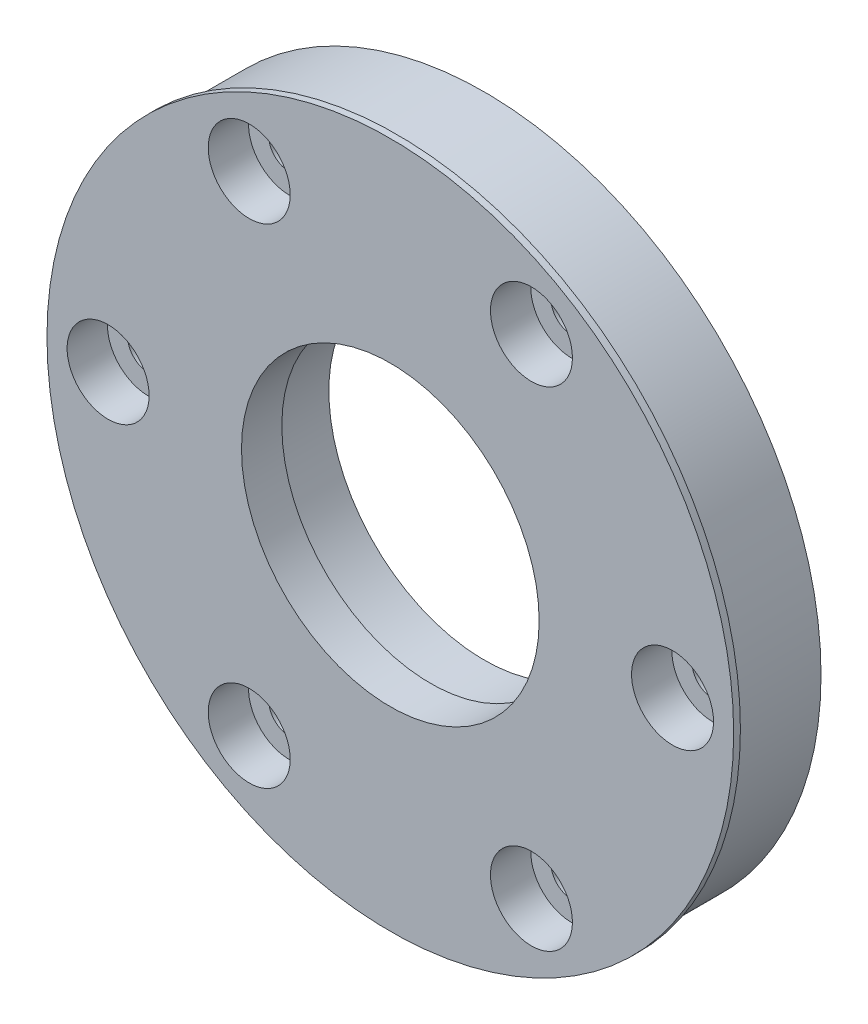
ISO-10303-21;
HEADER;
FILE_DESCRIPTION(('STEP AP214'),'2;1');
FILE_NAME('part.step','',(''),(''),'','','');
FILE_SCHEMA(('AUTOMOTIVE_DESIGN { 1 0 10303 214 1 1 1 1 }'));
ENDSEC;
DATA;
#1=APPLICATION_CONTEXT('core data for automotive mechanical design processes');
#2=APPLICATION_PROTOCOL_DEFINITION('international standard','automotive_design',2000,#1);
#3=PRODUCT_CONTEXT('',#1,'mechanical');
#4=PRODUCT('Part','Part','',(#3));
#5=PRODUCT_RELATED_PRODUCT_CATEGORY('part','',(#4));
#6=PRODUCT_DEFINITION_FORMATION('','',#4);
#7=PRODUCT_DEFINITION_CONTEXT('part definition',#1,'design');
#8=PRODUCT_DEFINITION('design','',#6,#7);
#9=PRODUCT_DEFINITION_SHAPE('','',#8);
#10=(LENGTH_UNIT() NAMED_UNIT(*) SI_UNIT(.MILLI.,.METRE.));
#11=(NAMED_UNIT(*) PLANE_ANGLE_UNIT() SI_UNIT($,.RADIAN.));
#12=(NAMED_UNIT(*) SI_UNIT($,.STERADIAN.) SOLID_ANGLE_UNIT());
#13=UNCERTAINTY_MEASURE_WITH_UNIT(LENGTH_MEASURE(1.E-05),#10,'distance_accuracy_value','');
#14=(GEOMETRIC_REPRESENTATION_CONTEXT(3) GLOBAL_UNCERTAINTY_ASSIGNED_CONTEXT((#13)) GLOBAL_UNIT_ASSIGNED_CONTEXT((#10,
#11,#12)) REPRESENTATION_CONTEXT('',''));
#15=CARTESIAN_POINT('',(0.,0.,0.));
#16=DIRECTION('',(0.,0.,1.));
#17=DIRECTION('',(1.,0.,0.));
#18=AXIS2_PLACEMENT_3D('',#15,#16,#17);
#19=CARTESIAN_POINT('',(0.,0.,0.));
#20=DIRECTION('',(0.,0.,1.));
#21=DIRECTION('',(1.,0.,0.));
#22=AXIS2_PLACEMENT_3D('',#19,#20,#21);
#23=CYLINDRICAL_SURFACE('',#22,11.575);
#24=CARTESIAN_POINT('',(0.,0.,0.));
#25=DIRECTION('',(0.,0.,1.));
#26=DIRECTION('',(1.,0.,0.));
#27=AXIS2_PLACEMENT_3D('',#24,#25,#26);
#28=CIRCLE('',#27,11.575);
#29=CARTESIAN_POINT('',(11.575,0.,0.));
#30=VERTEX_POINT('',#29);
#31=EDGE_CURVE('E203',#30,#30,#28,.T.);
#32=ORIENTED_EDGE('',*,*,#31,.F.);
#33=EDGE_LOOP('',(#32));
#34=FACE_BOUND('',#33,.T.);
#35=CARTESIAN_POINT('',(0.,0.,4.));
#36=DIRECTION('',(0.,0.,1.));
#37=DIRECTION('',(1.,0.,0.));
#38=AXIS2_PLACEMENT_3D('',#35,#36,#37);
#39=CIRCLE('',#38,11.575);
#40=CARTESIAN_POINT('',(11.575,0.,4.));
#41=VERTEX_POINT('',#40);
#42=EDGE_CURVE('E10',#41,#41,#39,.F.);
#43=ORIENTED_EDGE('',*,*,#42,.F.);
#44=EDGE_LOOP('',(#43));
#45=FACE_BOUND('',#44,.T.);
#46=ADVANCED_FACE('F41',(#34,#45),#23,.F.);
#47=CARTESIAN_POINT('',(10.5,18.1865334794732,7.));
#48=DIRECTION('',(0.,0.,-1.));
#49=DIRECTION('',(-1.,0.,0.));
#50=AXIS2_PLACEMENT_3D('',#47,#48,#49);
#51=CYLINDRICAL_SURFACE('',#50,1.55);
#52=CARTESIAN_POINT('',(10.5,18.1865334794732,4.));
#53=DIRECTION('',(0.,0.,1.));
#54=DIRECTION('',(1.,0.,0.));
#55=AXIS2_PLACEMENT_3D('',#52,#53,#54);
#56=CIRCLE('',#55,1.55);
#57=CARTESIAN_POINT('',(12.05,18.1865334794732,4.));
#58=VERTEX_POINT('',#57);
#59=EDGE_CURVE('E88',#58,#58,#56,.T.);
#60=ORIENTED_EDGE('',*,*,#59,.T.);
#61=EDGE_LOOP('',(#60));
#62=FACE_BOUND('',#61,.T.);
#63=CARTESIAN_POINT('',(10.5,18.1865334794732,1.7));
#64=DIRECTION('',(0.,0.,-1.));
#65=DIRECTION('',(-1.,0.,0.));
#66=AXIS2_PLACEMENT_3D('',#63,#64,#65);
#67=CIRCLE('',#66,1.55);
#68=CARTESIAN_POINT('',(8.95000000000001,18.1865334794732,1.7));
#69=VERTEX_POINT('',#68);
#70=EDGE_CURVE('E86',#69,#69,#67,.F.);
#71=ORIENTED_EDGE('',*,*,#70,.F.);
#72=EDGE_LOOP('',(#71));
#73=FACE_BOUND('',#72,.T.);
#74=ADVANCED_FACE('F271',(#62,#73),#51,.F.);
#75=CARTESIAN_POINT('',(-10.5,18.1865334794732,7.));
#76=DIRECTION('',(0.,0.,-1.));
#77=DIRECTION('',(-1.,0.,0.));
#78=AXIS2_PLACEMENT_3D('',#75,#76,#77);
#79=CYLINDRICAL_SURFACE('',#78,1.55);
#80=CARTESIAN_POINT('',(-10.5,18.1865334794732,4.));
#81=DIRECTION('',(0.,0.,1.));
#82=DIRECTION('',(1.,0.,0.));
#83=AXIS2_PLACEMENT_3D('',#80,#81,#82);
#84=CIRCLE('',#83,1.55);
#85=CARTESIAN_POINT('',(-8.95,18.1865334794732,4.));
#86=VERTEX_POINT('',#85);
#87=EDGE_CURVE('E93',#86,#86,#84,.T.);
#88=ORIENTED_EDGE('',*,*,#87,.T.);
#89=EDGE_LOOP('',(#88));
#90=FACE_BOUND('',#89,.T.);
#91=CARTESIAN_POINT('',(-10.5,18.1865334794732,1.7));
#92=DIRECTION('',(0.,0.,-1.));
#93=DIRECTION('',(-1.,0.,0.));
#94=AXIS2_PLACEMENT_3D('',#91,#92,#93);
#95=CIRCLE('',#94,1.55);
#96=CARTESIAN_POINT('',(-12.05,18.1865334794732,1.7));
#97=VERTEX_POINT('',#96);
#98=EDGE_CURVE('E83',#97,#97,#95,.F.);
#99=ORIENTED_EDGE('',*,*,#98,.F.);
#100=EDGE_LOOP('',(#99));
#101=FACE_BOUND('',#100,.T.);
#102=ADVANCED_FACE('F277',(#90,#101),#79,.F.);
#103=CARTESIAN_POINT('',(-21.,0.,7.));
#104=DIRECTION('',(0.,0.,-1.));
#105=DIRECTION('',(-1.,0.,0.));
#106=AXIS2_PLACEMENT_3D('',#103,#104,#105);
#107=CYLINDRICAL_SURFACE('',#106,1.55);
#108=CARTESIAN_POINT('',(-21.,0.,4.));
#109=DIRECTION('',(0.,0.,1.));
#110=DIRECTION('',(1.,0.,0.));
#111=AXIS2_PLACEMENT_3D('',#108,#109,#110);
#112=CIRCLE('',#111,1.55);
#113=CARTESIAN_POINT('',(-19.45,0.,4.));
#114=VERTEX_POINT('',#113);
#115=EDGE_CURVE('E100',#114,#114,#112,.T.);
#116=ORIENTED_EDGE('',*,*,#115,.T.);
#117=EDGE_LOOP('',(#116));
#118=FACE_BOUND('',#117,.T.);
#119=CARTESIAN_POINT('',(-21.,0.,1.7));
#120=DIRECTION('',(0.,0.,-1.));
#121=DIRECTION('',(-1.,0.,0.));
#122=AXIS2_PLACEMENT_3D('',#119,#120,#121);
#123=CIRCLE('',#122,1.55);
#124=CARTESIAN_POINT('',(-22.55,0.,1.7));
#125=VERTEX_POINT('',#124);
#126=EDGE_CURVE('E80',#125,#125,#123,.F.);
#127=ORIENTED_EDGE('',*,*,#126,.F.);
#128=EDGE_LOOP('',(#127));
#129=FACE_BOUND('',#128,.T.);
#130=ADVANCED_FACE('F458',(#118,#129),#107,.F.);
#131=CARTESIAN_POINT('',(-10.5,-18.1865334794732,7.));
#132=DIRECTION('',(0.,0.,-1.));
#133=DIRECTION('',(-1.,0.,0.));
#134=AXIS2_PLACEMENT_3D('',#131,#132,#133);
#135=CYLINDRICAL_SURFACE('',#134,1.55);
#136=CARTESIAN_POINT('',(-10.5,-18.1865334794732,4.));
#137=DIRECTION('',(0.,0.,1.));
#138=DIRECTION('',(1.,0.,0.));
#139=AXIS2_PLACEMENT_3D('',#136,#137,#138);
#140=CIRCLE('',#139,1.55);
#141=CARTESIAN_POINT('',(-8.95000000000001,-18.1865334794732,4.));
#142=VERTEX_POINT('',#141);
#143=EDGE_CURVE('E108',#142,#142,#140,.T.);
#144=ORIENTED_EDGE('',*,*,#143,.T.);
#145=EDGE_LOOP('',(#144));
#146=FACE_BOUND('',#145,.T.);
#147=CARTESIAN_POINT('',(-10.5,-18.1865334794732,1.7));
#148=DIRECTION('',(0.,0.,-1.));
#149=DIRECTION('',(-1.,0.,0.));
#150=AXIS2_PLACEMENT_3D('',#147,#148,#149);
#151=CIRCLE('',#150,1.55);
#152=CARTESIAN_POINT('',(-12.05,-18.1865334794732,1.7));
#153=VERTEX_POINT('',#152);
#154=EDGE_CURVE('E77',#153,#153,#151,.F.);
#155=ORIENTED_EDGE('',*,*,#154,.F.);
#156=EDGE_LOOP('',(#155));
#157=FACE_BOUND('',#156,.T.);
#158=ADVANCED_FACE('F449',(#146,#157),#135,.F.);
#159=CARTESIAN_POINT('',(10.5,-18.1865334794732,7.));
#160=DIRECTION('',(0.,0.,-1.));
#161=DIRECTION('',(-1.,0.,0.));
#162=AXIS2_PLACEMENT_3D('',#159,#160,#161);
#163=CYLINDRICAL_SURFACE('',#162,1.55);
#164=CARTESIAN_POINT('',(10.5,-18.1865334794732,4.));
#165=DIRECTION('',(0.,0.,1.));
#166=DIRECTION('',(1.,0.,0.));
#167=AXIS2_PLACEMENT_3D('',#164,#165,#166);
#168=CIRCLE('',#167,1.55);
#169=CARTESIAN_POINT('',(12.05,-18.1865334794732,4.));
#170=VERTEX_POINT('',#169);
#171=EDGE_CURVE('E112',#170,#170,#168,.T.);
#172=ORIENTED_EDGE('',*,*,#171,.T.);
#173=EDGE_LOOP('',(#172));
#174=FACE_BOUND('',#173,.T.);
#175=CARTESIAN_POINT('',(10.5,-18.1865334794732,1.7));
#176=DIRECTION('',(0.,0.,-1.));
#177=DIRECTION('',(-1.,0.,0.));
#178=AXIS2_PLACEMENT_3D('',#175,#176,#177);
#179=CIRCLE('',#178,1.55);
#180=CARTESIAN_POINT('',(8.94999999999999,-18.1865334794732,1.7));
#181=VERTEX_POINT('',#180);
#182=EDGE_CURVE('E72',#181,#181,#179,.F.);
#183=ORIENTED_EDGE('',*,*,#182,.F.);
#184=EDGE_LOOP('',(#183));
#185=FACE_BOUND('',#184,.T.);
#186=ADVANCED_FACE('F440',(#174,#185),#163,.F.);
#187=CARTESIAN_POINT('',(21.,0.,7.));
#188=DIRECTION('',(0.,0.,-1.));
#189=DIRECTION('',(-1.,0.,0.));
#190=AXIS2_PLACEMENT_3D('',#187,#188,#189);
#191=CYLINDRICAL_SURFACE('',#190,1.55);
#192=CARTESIAN_POINT('',(21.,0.,4.));
#193=DIRECTION('',(0.,0.,1.));
#194=DIRECTION('',(1.,0.,0.));
#195=AXIS2_PLACEMENT_3D('',#192,#193,#194);
#196=CIRCLE('',#195,1.55);
#197=CARTESIAN_POINT('',(22.55,0.,4.));
#198=VERTEX_POINT('',#197);
#199=EDGE_CURVE('E116',#198,#198,#196,.T.);
#200=ORIENTED_EDGE('',*,*,#199,.T.);
#201=EDGE_LOOP('',(#200));
#202=FACE_BOUND('',#201,.T.);
#203=CARTESIAN_POINT('',(21.,0.,1.7));
#204=DIRECTION('',(0.,0.,-1.));
#205=DIRECTION('',(-1.,0.,0.));
#206=AXIS2_PLACEMENT_3D('',#203,#204,#205);
#207=CIRCLE('',#206,1.55);
#208=CARTESIAN_POINT('',(19.45,0.,1.7));
#209=VERTEX_POINT('',#208);
#210=EDGE_CURVE('E68',#209,#209,#207,.F.);
#211=ORIENTED_EDGE('',*,*,#210,.F.);
#212=EDGE_LOOP('',(#211));
#213=FACE_BOUND('',#212,.T.);
#214=ADVANCED_FACE('F184',(#202,#213),#191,.F.);
#215=CARTESIAN_POINT('',(0.,0.,7.));
#216=DIRECTION('',(0.,0.,1.));
#217=DIRECTION('',(1.,0.,0.));
#218=AXIS2_PLACEMENT_3D('',#215,#216,#217);
#219=PLANE('',#218);
#220=CARTESIAN_POINT('',(-21.,1.46638343828664E-13,7.));
#221=DIRECTION('',(0.,0.,1.));
#222=DIRECTION('',(1.,0.,0.));
#223=AXIS2_PLACEMENT_3D('',#220,#221,#222);
#224=CIRCLE('',#223,3.05);
#225=CARTESIAN_POINT('',(-17.95,1.46638343828664E-13,7.));
#226=VERTEX_POINT('',#225);
#227=EDGE_CURVE('E130',#226,#226,#224,.T.);
#228=ORIENTED_EDGE('',*,*,#227,.F.);
#229=EDGE_LOOP('',(#228));
#230=FACE_BOUND('',#229,.T.);
#231=CARTESIAN_POINT('',(-10.5000000000003,-18.186533479473,7.));
#232=DIRECTION('',(0.,0.,1.));
#233=DIRECTION('',(1.,0.,0.));
#234=AXIS2_PLACEMENT_3D('',#231,#232,#233);
#235=CIRCLE('',#234,3.05);
#236=CARTESIAN_POINT('',(-7.45000000000034,-18.186533479473,7.));
#237=VERTEX_POINT('',#236);
#238=EDGE_CURVE('E134',#237,#237,#235,.T.);
#239=ORIENTED_EDGE('',*,*,#238,.F.);
#240=EDGE_LOOP('',(#239));
#241=FACE_BOUND('',#240,.T.);
#242=CARTESIAN_POINT('',(10.5000000000001,-18.1865334794728,7.));
#243=DIRECTION('',(0.,0.,1.));
#244=DIRECTION('',(1.,0.,0.));
#245=AXIS2_PLACEMENT_3D('',#242,#243,#244);
#246=CIRCLE('',#245,3.05);
#247=CARTESIAN_POINT('',(13.5500000000001,-18.1865334794728,7.));
#248=VERTEX_POINT('',#247);
#249=EDGE_CURVE('E164',#248,#248,#246,.T.);
#250=ORIENTED_EDGE('',*,*,#249,.F.);
#251=EDGE_LOOP('',(#250));
#252=FACE_BOUND('',#251,.T.);
#253=CARTESIAN_POINT('',(21.,-1.44066585550455E-13,7.));
#254=DIRECTION('',(0.,0.,1.));
#255=DIRECTION('',(1.,0.,0.));
#256=AXIS2_PLACEMENT_3D('',#253,#254,#255);
#257=CIRCLE('',#256,3.05);
#258=CARTESIAN_POINT('',(24.05,-1.44066585550455E-13,7.));
#259=VERTEX_POINT('',#258);
#260=EDGE_CURVE('E157',#259,#259,#257,.T.);
#261=ORIENTED_EDGE('',*,*,#260,.F.);
#262=EDGE_LOOP('',(#261));
#263=FACE_BOUND('',#262,.T.);
#264=CARTESIAN_POINT('',(10.4999999999999,18.1865334794736,7.));
#265=DIRECTION('',(0.,0.,1.));
#266=DIRECTION('',(1.,0.,0.));
#267=AXIS2_PLACEMENT_3D('',#264,#265,#266);
#268=CIRCLE('',#267,3.05);
#269=CARTESIAN_POINT('',(13.5499999999999,18.1865334794736,7.));
#270=VERTEX_POINT('',#269);
#271=EDGE_CURVE('E149',#270,#270,#268,.T.);
#272=ORIENTED_EDGE('',*,*,#271,.F.);
#273=EDGE_LOOP('',(#272));
#274=FACE_BOUND('',#273,.T.);
#275=CARTESIAN_POINT('',(-10.4999999999998,18.1865334794733,7.));
#276=DIRECTION('',(0.,0.,1.));
#277=DIRECTION('',(1.,0.,0.));
#278=AXIS2_PLACEMENT_3D('',#275,#276,#277);
#279=CIRCLE('',#278,3.05);
#280=CARTESIAN_POINT('',(-7.44999999999983,18.1865334794733,7.));
#281=VERTEX_POINT('',#280);
#282=EDGE_CURVE('E133',#281,#281,#279,.T.);
#283=ORIENTED_EDGE('',*,*,#282,.F.);
#284=EDGE_LOOP('',(#283));
#285=FACE_BOUND('',#284,.T.);
#286=CARTESIAN_POINT('',(0.,0.,7.));
#287=DIRECTION('',(0.,0.,1.));
#288=DIRECTION('',(1.,0.,0.));
#289=AXIS2_PLACEMENT_3D('',#286,#287,#288);
#290=CIRCLE('',#289,25.55);
#291=CARTESIAN_POINT('',(25.55,0.,7.));
#292=VERTEX_POINT('',#291);
#293=EDGE_CURVE('E120',#292,#292,#290,.T.);
#294=ORIENTED_EDGE('',*,*,#293,.T.);
#295=EDGE_LOOP('',(#294));
#296=FACE_BOUND('',#295,.T.);
#297=CARTESIAN_POINT('',(0.,0.,7.));
#298=DIRECTION('',(0.,0.,1.));
#299=DIRECTION('',(1.,0.,0.));
#300=AXIS2_PLACEMENT_3D('',#297,#298,#299);
#301=CIRCLE('',#300,11.075);
#302=CARTESIAN_POINT('',(11.075,0.,7.));
#303=VERTEX_POINT('',#302);
#304=EDGE_CURVE('E197',#303,#303,#301,.T.);
#305=ORIENTED_EDGE('',*,*,#304,.F.);
#306=EDGE_LOOP('',(#305));
#307=FACE_BOUND('',#306,.T.);
#308=ADVANCED_FACE('F180',(#230,#241,#252,#263,#274,#285,#296,#307),#219,.T.);
#309=CARTESIAN_POINT('',(-10.4999999999998,18.1865334794733,4.));
#310=DIRECTION('',(0.,0.,1.));
#311=DIRECTION('',(1.,0.,0.));
#312=AXIS2_PLACEMENT_3D('',#309,#310,#311);
#313=CYLINDRICAL_SURFACE('',#312,3.05);
#314=CARTESIAN_POINT('',(-10.4999999999998,18.1865334794733,4.));
#315=DIRECTION('',(0.,0.,1.));
#316=DIRECTION('',(1.,0.,0.));
#317=AXIS2_PLACEMENT_3D('',#314,#315,#316);
#318=CIRCLE('',#317,3.05);
#319=CARTESIAN_POINT('',(-7.44999999999983,18.1865334794733,4.));
#320=VERTEX_POINT('',#319);
#321=EDGE_CURVE('E145',#320,#320,#318,.T.);
#322=ORIENTED_EDGE('',*,*,#321,.F.);
#323=EDGE_LOOP('',(#322));
#324=FACE_BOUND('',#323,.T.);
#325=ORIENTED_EDGE('',*,*,#282,.T.);
#326=EDGE_LOOP('',(#325));
#327=FACE_BOUND('',#326,.T.);
#328=ADVANCED_FACE('F183',(#324,#327),#313,.F.);
#329=CARTESIAN_POINT('',(-10.4999999999998,18.1865334794733,4.));
#330=DIRECTION('',(0.,0.,1.));
#331=DIRECTION('',(1.,0.,0.));
#332=AXIS2_PLACEMENT_3D('',#329,#330,#331);
#333=PLANE('',#332);
#334=ORIENTED_EDGE('',*,*,#87,.F.);
#335=EDGE_LOOP('',(#334));
#336=FACE_BOUND('',#335,.T.);
#337=ORIENTED_EDGE('',*,*,#321,.T.);
#338=EDGE_LOOP('',(#337));
#339=FACE_BOUND('',#338,.T.);
#340=ADVANCED_FACE('F359',(#336,#339),#333,.T.);
#341=CARTESIAN_POINT('',(10.4999999999999,18.1865334794736,4.));
#342=DIRECTION('',(0.,0.,1.));
#343=DIRECTION('',(1.,0.,0.));
#344=AXIS2_PLACEMENT_3D('',#341,#342,#343);
#345=CYLINDRICAL_SURFACE('',#344,3.05);
#346=CARTESIAN_POINT('',(10.4999999999999,18.1865334794736,4.));
#347=DIRECTION('',(0.,0.,1.));
#348=DIRECTION('',(1.,0.,0.));
#349=AXIS2_PLACEMENT_3D('',#346,#347,#348);
#350=CIRCLE('',#349,3.05);
#351=CARTESIAN_POINT('',(13.5499999999999,18.1865334794736,4.));
#352=VERTEX_POINT('',#351);
#353=EDGE_CURVE('E153',#352,#352,#350,.T.);
#354=ORIENTED_EDGE('',*,*,#353,.F.);
#355=EDGE_LOOP('',(#354));
#356=FACE_BOUND('',#355,.T.);
#357=ORIENTED_EDGE('',*,*,#271,.T.);
#358=EDGE_LOOP('',(#357));
#359=FACE_BOUND('',#358,.T.);
#360=ADVANCED_FACE('F369',(#356,#359),#345,.F.);
#361=CARTESIAN_POINT('',(10.4999999999999,18.1865334794736,4.));
#362=DIRECTION('',(0.,0.,1.));
#363=DIRECTION('',(1.,0.,0.));
#364=AXIS2_PLACEMENT_3D('',#361,#362,#363);
#365=PLANE('',#364);
#366=ORIENTED_EDGE('',*,*,#59,.F.);
#367=EDGE_LOOP('',(#366));
#368=FACE_BOUND('',#367,.T.);
#369=ORIENTED_EDGE('',*,*,#353,.T.);
#370=EDGE_LOOP('',(#369));
#371=FACE_BOUND('',#370,.T.);
#372=ADVANCED_FACE('F373',(#368,#371),#365,.T.);
#373=CARTESIAN_POINT('',(21.,-1.44066585550455E-13,4.));
#374=DIRECTION('',(0.,0.,1.));
#375=DIRECTION('',(1.,0.,0.));
#376=AXIS2_PLACEMENT_3D('',#373,#374,#375);
#377=CYLINDRICAL_SURFACE('',#376,3.05);
#378=CARTESIAN_POINT('',(21.,-1.44066585550455E-13,4.));
#379=DIRECTION('',(0.,0.,1.));
#380=DIRECTION('',(1.,0.,0.));
#381=AXIS2_PLACEMENT_3D('',#378,#379,#380);
#382=CIRCLE('',#381,3.05);
#383=CARTESIAN_POINT('',(24.05,-1.44066585550455E-13,4.));
#384=VERTEX_POINT('',#383);
#385=EDGE_CURVE('E160',#384,#384,#382,.T.);
#386=ORIENTED_EDGE('',*,*,#385,.F.);
#387=EDGE_LOOP('',(#386));
#388=FACE_BOUND('',#387,.T.);
#389=ORIENTED_EDGE('',*,*,#260,.T.);
#390=EDGE_LOOP('',(#389));
#391=FACE_BOUND('',#390,.T.);
#392=ADVANCED_FACE('F380',(#388,#391),#377,.F.);
#393=CARTESIAN_POINT('',(21.,-1.44066585550455E-13,4.));
#394=DIRECTION('',(0.,0.,1.));
#395=DIRECTION('',(1.,0.,0.));
#396=AXIS2_PLACEMENT_3D('',#393,#394,#395);
#397=PLANE('',#396);
#398=ORIENTED_EDGE('',*,*,#199,.F.);
#399=EDGE_LOOP('',(#398));
#400=FACE_BOUND('',#399,.T.);
#401=ORIENTED_EDGE('',*,*,#385,.T.);
#402=EDGE_LOOP('',(#401));
#403=FACE_BOUND('',#402,.T.);
#404=ADVANCED_FACE('F176',(#400,#403),#397,.T.);
#405=CARTESIAN_POINT('',(10.5000000000001,-18.1865334794728,4.));
#406=DIRECTION('',(0.,0.,1.));
#407=DIRECTION('',(1.,0.,0.));
#408=AXIS2_PLACEMENT_3D('',#405,#406,#407);
#409=CYLINDRICAL_SURFACE('',#408,3.05);
#410=CARTESIAN_POINT('',(10.5000000000001,-18.1865334794728,4.));
#411=DIRECTION('',(0.,0.,1.));
#412=DIRECTION('',(1.,0.,0.));
#413=AXIS2_PLACEMENT_3D('',#410,#411,#412);
#414=CIRCLE('',#413,3.05);
#415=CARTESIAN_POINT('',(13.5500000000001,-18.1865334794728,4.));
#416=VERTEX_POINT('',#415);
#417=EDGE_CURVE('E138',#416,#416,#414,.T.);
#418=ORIENTED_EDGE('',*,*,#417,.F.);
#419=EDGE_LOOP('',(#418));
#420=FACE_BOUND('',#419,.T.);
#421=ORIENTED_EDGE('',*,*,#249,.T.);
#422=EDGE_LOOP('',(#421));
#423=FACE_BOUND('',#422,.T.);
#424=ADVANCED_FACE('F173',(#420,#423),#409,.F.);
#425=CARTESIAN_POINT('',(10.5000000000001,-18.1865334794728,4.));
#426=DIRECTION('',(0.,0.,1.));
#427=DIRECTION('',(1.,0.,0.));
#428=AXIS2_PLACEMENT_3D('',#425,#426,#427);
#429=PLANE('',#428);
#430=ORIENTED_EDGE('',*,*,#171,.F.);
#431=EDGE_LOOP('',(#430));
#432=FACE_BOUND('',#431,.T.);
#433=ORIENTED_EDGE('',*,*,#417,.T.);
#434=EDGE_LOOP('',(#433));
#435=FACE_BOUND('',#434,.T.);
#436=ADVANCED_FACE('F171',(#432,#435),#429,.T.);
#437=CARTESIAN_POINT('',(-10.5000000000003,-18.186533479473,4.));
#438=DIRECTION('',(0.,0.,1.));
#439=DIRECTION('',(1.,0.,0.));
#440=AXIS2_PLACEMENT_3D('',#437,#438,#439);
#441=CYLINDRICAL_SURFACE('',#440,3.05);
#442=CARTESIAN_POINT('',(-10.5000000000003,-18.186533479473,4.));
#443=DIRECTION('',(0.,0.,1.));
#444=DIRECTION('',(1.,0.,0.));
#445=AXIS2_PLACEMENT_3D('',#442,#443,#444);
#446=CIRCLE('',#445,3.05);
#447=CARTESIAN_POINT('',(-7.45000000000034,-18.186533479473,4.));
#448=VERTEX_POINT('',#447);
#449=EDGE_CURVE('E124',#448,#448,#446,.T.);
#450=ORIENTED_EDGE('',*,*,#449,.F.);
#451=EDGE_LOOP('',(#450));
#452=FACE_BOUND('',#451,.T.);
#453=ORIENTED_EDGE('',*,*,#238,.T.);
#454=EDGE_LOOP('',(#453));
#455=FACE_BOUND('',#454,.T.);
#456=ADVANCED_FACE('F396',(#452,#455),#441,.F.);
#457=CARTESIAN_POINT('',(-10.5000000000003,-18.186533479473,4.));
#458=DIRECTION('',(0.,0.,1.));
#459=DIRECTION('',(1.,0.,0.));
#460=AXIS2_PLACEMENT_3D('',#457,#458,#459);
#461=PLANE('',#460);
#462=ORIENTED_EDGE('',*,*,#143,.F.);
#463=EDGE_LOOP('',(#462));
#464=FACE_BOUND('',#463,.T.);
#465=ORIENTED_EDGE('',*,*,#449,.T.);
#466=EDGE_LOOP('',(#465));
#467=FACE_BOUND('',#466,.T.);
#468=ADVANCED_FACE('F400',(#464,#467),#461,.T.);
#469=CARTESIAN_POINT('',(-21.,1.46638343828664E-13,4.));
#470=DIRECTION('',(0.,0.,1.));
#471=DIRECTION('',(1.,0.,0.));
#472=AXIS2_PLACEMENT_3D('',#469,#470,#471);
#473=CYLINDRICAL_SURFACE('',#472,3.05);
#474=CARTESIAN_POINT('',(-21.,1.46638343828664E-13,4.));
#475=DIRECTION('',(0.,0.,1.));
#476=DIRECTION('',(1.,0.,0.));
#477=AXIS2_PLACEMENT_3D('',#474,#475,#476);
#478=CIRCLE('',#477,3.05);
#479=CARTESIAN_POINT('',(-17.95,1.46638343828664E-13,4.));
#480=VERTEX_POINT('',#479);
#481=EDGE_CURVE('E64',#480,#480,#478,.T.);
#482=ORIENTED_EDGE('',*,*,#481,.F.);
#483=EDGE_LOOP('',(#482));
#484=FACE_BOUND('',#483,.T.);
#485=ORIENTED_EDGE('',*,*,#227,.T.);
#486=EDGE_LOOP('',(#485));
#487=FACE_BOUND('',#486,.T.);
#488=ADVANCED_FACE('F407',(#484,#487),#473,.F.);
#489=CARTESIAN_POINT('',(-21.,1.46638343828664E-13,4.));
#490=DIRECTION('',(0.,0.,1.));
#491=DIRECTION('',(1.,0.,0.));
#492=AXIS2_PLACEMENT_3D('',#489,#490,#491);
#493=PLANE('',#492);
#494=ORIENTED_EDGE('',*,*,#115,.F.);
#495=EDGE_LOOP('',(#494));
#496=FACE_BOUND('',#495,.T.);
#497=ORIENTED_EDGE('',*,*,#481,.T.);
#498=EDGE_LOOP('',(#497));
#499=FACE_BOUND('',#498,.T.);
#500=ADVANCED_FACE('F411',(#496,#499),#493,.T.);
#501=CARTESIAN_POINT('',(0.,0.,6.5));
#502=DIRECTION('',(0.,0.,1.));
#503=DIRECTION('',(1.,0.,0.));
#504=AXIS2_PLACEMENT_3D('',#501,#502,#503);
#505=CYLINDRICAL_SURFACE('',#504,25.55);
#506=CARTESIAN_POINT('',(0.,0.,6.5));
#507=DIRECTION('',(0.,0.,1.));
#508=DIRECTION('',(1.,0.,0.));
#509=AXIS2_PLACEMENT_3D('',#506,#507,#508);
#510=CIRCLE('',#509,25.55);
#511=CARTESIAN_POINT('',(25.55,0.,6.5));
#512=VERTEX_POINT('',#511);
#513=EDGE_CURVE('E121',#512,#512,#510,.T.);
#514=ORIENTED_EDGE('',*,*,#513,.T.);
#515=EDGE_LOOP('',(#514));
#516=FACE_BOUND('',#515,.T.);
#517=ORIENTED_EDGE('',*,*,#293,.F.);
#518=EDGE_LOOP('',(#517));
#519=FACE_BOUND('',#518,.T.);
#520=ADVANCED_FACE('F418',(#516,#519),#505,.T.);
#521=CARTESIAN_POINT('',(0.,0.,6.5));
#522=DIRECTION('',(0.,0.,1.));
#523=DIRECTION('',(1.,0.,0.));
#524=AXIS2_PLACEMENT_3D('',#521,#522,#523);
#525=PLANE('',#524);
#526=CARTESIAN_POINT('',(0.,0.,6.5));
#527=DIRECTION('',(0.,0.,1.));
#528=DIRECTION('',(1.,0.,0.));
#529=AXIS2_PLACEMENT_3D('',#526,#527,#528);
#530=CIRCLE('',#529,25.05);
#531=CARTESIAN_POINT('',(25.05,0.,6.5));
#532=VERTEX_POINT('',#531);
#533=EDGE_CURVE('E49',#532,#532,#530,.T.);
#534=ORIENTED_EDGE('',*,*,#533,.T.);
#535=EDGE_LOOP('',(#534));
#536=FACE_BOUND('',#535,.T.);
#537=ORIENTED_EDGE('',*,*,#513,.F.);
#538=EDGE_LOOP('',(#537));
#539=FACE_BOUND('',#538,.T.);
#540=ADVANCED_FACE('F327',(#536,#539),#525,.F.);
#541=CARTESIAN_POINT('',(0.,0.,0.));
#542=DIRECTION('',(0.,0.,1.));
#543=DIRECTION('',(1.,0.,0.));
#544=AXIS2_PLACEMENT_3D('',#541,#542,#543);
#545=PLANE('',#544);
#546=ORIENTED_EDGE('',*,*,#31,.T.);
#547=EDGE_LOOP('',(#546));
#548=FACE_BOUND('',#547,.T.);
#549=CARTESIAN_POINT('',(21.,0.,0.));
#550=DIRECTION('',(0.,0.,-1.));
#551=DIRECTION('',(-1.,0.,0.));
#552=AXIS2_PLACEMENT_3D('',#549,#550,#551);
#553=CIRCLE('',#552,3.);
#554=CARTESIAN_POINT('',(18.,0.,0.));
#555=VERTEX_POINT('',#554);
#556=EDGE_CURVE('E213',#555,#555,#553,.T.);
#557=ORIENTED_EDGE('',*,*,#556,.F.);
#558=EDGE_LOOP('',(#557));
#559=FACE_BOUND('',#558,.T.);
#560=CARTESIAN_POINT('',(10.5000000000002,-18.1865334794731,0.));
#561=DIRECTION('',(0.,0.,-1.));
#562=DIRECTION('',(-1.,0.,0.));
#563=AXIS2_PLACEMENT_3D('',#560,#561,#562);
#564=CIRCLE('',#563,3.);
#565=CARTESIAN_POINT('',(7.50000000000022,-18.1865334794731,0.));
#566=VERTEX_POINT('',#565);
#567=EDGE_CURVE('E217',#566,#566,#564,.T.);
#568=ORIENTED_EDGE('',*,*,#567,.F.);
#569=EDGE_LOOP('',(#568));
#570=FACE_BOUND('',#569,.T.);
#571=CARTESIAN_POINT('',(-10.4999999999998,-18.1865334794733,0.));
#572=DIRECTION('',(0.,0.,-1.));
#573=DIRECTION('',(-1.,0.,0.));
#574=AXIS2_PLACEMENT_3D('',#571,#572,#573);
#575=CIRCLE('',#574,3.);
#576=CARTESIAN_POINT('',(-13.4999999999998,-18.1865334794733,0.));
#577=VERTEX_POINT('',#576);
#578=EDGE_CURVE('E245',#577,#577,#575,.T.);
#579=ORIENTED_EDGE('',*,*,#578,.F.);
#580=EDGE_LOOP('',(#579));
#581=FACE_BOUND('',#580,.T.);
#582=CARTESIAN_POINT('',(-21.,-1.4658413372004E-13,0.));
#583=DIRECTION('',(0.,0.,-1.));
#584=DIRECTION('',(-1.,0.,0.));
#585=AXIS2_PLACEMENT_3D('',#582,#583,#584);
#586=CIRCLE('',#585,3.);
#587=CARTESIAN_POINT('',(-24.,-1.4658413372004E-13,0.));
#588=VERTEX_POINT('',#587);
#589=EDGE_CURVE('E238',#588,#588,#586,.T.);
#590=ORIENTED_EDGE('',*,*,#589,.F.);
#591=EDGE_LOOP('',(#590));
#592=FACE_BOUND('',#591,.T.);
#593=CARTESIAN_POINT('',(-10.5000000000001,18.1865334794732,0.));
#594=DIRECTION('',(0.,0.,-1.));
#595=DIRECTION('',(-1.,0.,0.));
#596=AXIS2_PLACEMENT_3D('',#593,#594,#595);
#597=CIRCLE('',#596,3.);
#598=CARTESIAN_POINT('',(-13.5000000000001,18.1865334794732,0.));
#599=VERTEX_POINT('',#598);
#600=EDGE_CURVE('E230',#599,#599,#597,.T.);
#601=ORIENTED_EDGE('',*,*,#600,.F.);
#602=EDGE_LOOP('',(#601));
#603=FACE_BOUND('',#602,.T.);
#604=CARTESIAN_POINT('',(10.5,18.1865334794732,0.));
#605=DIRECTION('',(0.,0.,-1.));
#606=DIRECTION('',(-1.,0.,0.));
#607=AXIS2_PLACEMENT_3D('',#604,#605,#606);
#608=CIRCLE('',#607,3.);
#609=CARTESIAN_POINT('',(7.49999999999996,18.1865334794732,0.));
#610=VERTEX_POINT('',#609);
#611=EDGE_CURVE('E216',#610,#610,#608,.T.);
#612=ORIENTED_EDGE('',*,*,#611,.F.);
#613=EDGE_LOOP('',(#612));
#614=FACE_BOUND('',#613,.T.);
#615=CARTESIAN_POINT('',(0.,0.,0.));
#616=DIRECTION('',(0.,0.,1.));
#617=DIRECTION('',(1.,0.,0.));
#618=AXIS2_PLACEMENT_3D('',#615,#616,#617);
#619=CIRCLE('',#618,25.05);
#620=CARTESIAN_POINT('',(25.05,0.,0.));
#621=VERTEX_POINT('',#620);
#622=EDGE_CURVE('E56',#621,#621,#619,.T.);
#623=ORIENTED_EDGE('',*,*,#622,.F.);
#624=EDGE_LOOP('',(#623));
#625=FACE_BOUND('',#624,.T.);
#626=ADVANCED_FACE('F324',(#548,#559,#570,#581,#592,#603,#614,#625),#545,.F.);
#627=CARTESIAN_POINT('',(0.,0.,7.));
#628=DIRECTION('',(0.,0.,-1.));
#629=DIRECTION('',(-1.,0.,0.));
#630=AXIS2_PLACEMENT_3D('',#627,#628,#629);
#631=CYLINDRICAL_SURFACE('',#630,25.05);
#632=ORIENTED_EDGE('',*,*,#622,.T.);
#633=EDGE_LOOP('',(#632));
#634=FACE_BOUND('',#633,.T.);
#635=ORIENTED_EDGE('',*,*,#533,.F.);
#636=EDGE_LOOP('',(#635));
#637=FACE_BOUND('',#636,.T.);
#638=ADVANCED_FACE('F43',(#634,#637),#631,.T.);
#639=CARTESIAN_POINT('',(21.,0.,1.7));
#640=DIRECTION('',(0.,0.,-1.));
#641=DIRECTION('',(-1.,0.,0.));
#642=AXIS2_PLACEMENT_3D('',#639,#640,#641);
#643=PLANE('',#642);
#644=CARTESIAN_POINT('',(21.,0.,1.7));
#645=DIRECTION('',(0.,0.,-1.));
#646=DIRECTION('',(-1.,0.,0.));
#647=AXIS2_PLACEMENT_3D('',#644,#645,#646);
#648=CIRCLE('',#647,3.);
#649=CARTESIAN_POINT('',(18.,0.,1.7));
#650=VERTEX_POINT('',#649);
#651=EDGE_CURVE('E73',#650,#650,#648,.T.);
#652=ORIENTED_EDGE('',*,*,#651,.T.);
#653=EDGE_LOOP('',(#652));
#654=FACE_BOUND('',#653,.T.);
#655=ORIENTED_EDGE('',*,*,#210,.T.);
#656=EDGE_LOOP('',(#655));
#657=FACE_BOUND('',#656,.T.);
#658=ADVANCED_FACE('F285',(#654,#657),#643,.T.);
#659=CARTESIAN_POINT('',(21.,0.,1.7));
#660=DIRECTION('',(0.,0.,-1.));
#661=DIRECTION('',(-1.,0.,0.));
#662=AXIS2_PLACEMENT_3D('',#659,#660,#661);
#663=CYLINDRICAL_SURFACE('',#662,3.);
#664=ORIENTED_EDGE('',*,*,#651,.F.);
#665=EDGE_LOOP('',(#664));
#666=FACE_BOUND('',#665,.T.);
#667=ORIENTED_EDGE('',*,*,#556,.T.);
#668=EDGE_LOOP('',(#667));
#669=FACE_BOUND('',#668,.T.);
#670=ADVANCED_FACE('F288',(#666,#669),#663,.F.);
#671=CARTESIAN_POINT('',(10.5000000000002,-18.1865334794731,1.7));
#672=DIRECTION('',(0.,0.,-1.));
#673=DIRECTION('',(-1.,0.,0.));
#674=AXIS2_PLACEMENT_3D('',#671,#672,#673);
#675=PLANE('',#674);
#676=CARTESIAN_POINT('',(10.5000000000002,-18.1865334794731,1.7));
#677=DIRECTION('',(0.,0.,-1.));
#678=DIRECTION('',(-1.,0.,0.));
#679=AXIS2_PLACEMENT_3D('',#676,#677,#678);
#680=CIRCLE('',#679,3.);
#681=CARTESIAN_POINT('',(7.50000000000022,-18.1865334794731,1.7));
#682=VERTEX_POINT('',#681);
#683=EDGE_CURVE('E209',#682,#682,#680,.T.);
#684=ORIENTED_EDGE('',*,*,#683,.T.);
#685=EDGE_LOOP('',(#684));
#686=FACE_BOUND('',#685,.T.);
#687=ORIENTED_EDGE('',*,*,#182,.T.);
#688=EDGE_LOOP('',(#687));
#689=FACE_BOUND('',#688,.T.);
#690=ADVANCED_FACE('F292',(#686,#689),#675,.T.);
#691=CARTESIAN_POINT('',(10.5000000000002,-18.1865334794731,1.7));
#692=DIRECTION('',(0.,0.,-1.));
#693=DIRECTION('',(-1.,0.,0.));
#694=AXIS2_PLACEMENT_3D('',#691,#692,#693);
#695=CYLINDRICAL_SURFACE('',#694,3.);
#696=ORIENTED_EDGE('',*,*,#683,.F.);
#697=EDGE_LOOP('',(#696));
#698=FACE_BOUND('',#697,.T.);
#699=ORIENTED_EDGE('',*,*,#567,.T.);
#700=EDGE_LOOP('',(#699));
#701=FACE_BOUND('',#700,.T.);
#702=ADVANCED_FACE('F268',(#698,#701),#695,.F.);
#703=CARTESIAN_POINT('',(-10.4999999999998,-18.1865334794733,1.7));
#704=DIRECTION('',(0.,0.,-1.));
#705=DIRECTION('',(-1.,0.,0.));
#706=AXIS2_PLACEMENT_3D('',#703,#704,#705);
#707=PLANE('',#706);
#708=CARTESIAN_POINT('',(-10.4999999999998,-18.1865334794733,1.7));
#709=DIRECTION('',(0.,0.,-1.));
#710=DIRECTION('',(-1.,0.,0.));
#711=AXIS2_PLACEMENT_3D('',#708,#709,#710);
#712=CIRCLE('',#711,3.);
#713=CARTESIAN_POINT('',(-13.4999999999998,-18.1865334794733,1.7));
#714=VERTEX_POINT('',#713);
#715=EDGE_CURVE('E103',#714,#714,#712,.T.);
#716=ORIENTED_EDGE('',*,*,#715,.T.);
#717=EDGE_LOOP('',(#716));
#718=FACE_BOUND('',#717,.T.);
#719=ORIENTED_EDGE('',*,*,#154,.T.);
#720=EDGE_LOOP('',(#719));
#721=FACE_BOUND('',#720,.T.);
#722=ADVANCED_FACE('F254',(#718,#721),#707,.T.);
#723=CARTESIAN_POINT('',(-10.4999999999998,-18.1865334794733,1.7));
#724=DIRECTION('',(0.,0.,-1.));
#725=DIRECTION('',(-1.,0.,0.));
#726=AXIS2_PLACEMENT_3D('',#723,#724,#725);
#727=CYLINDRICAL_SURFACE('',#726,3.);
#728=ORIENTED_EDGE('',*,*,#715,.F.);
#729=EDGE_LOOP('',(#728));
#730=FACE_BOUND('',#729,.T.);
#731=ORIENTED_EDGE('',*,*,#578,.T.);
#732=EDGE_LOOP('',(#731));
#733=FACE_BOUND('',#732,.T.);
#734=ADVANCED_FACE('F257',(#730,#733),#727,.F.);
#735=CARTESIAN_POINT('',(-21.,-1.4658413372004E-13,1.7));
#736=DIRECTION('',(0.,0.,-1.));
#737=DIRECTION('',(-1.,0.,0.));
#738=AXIS2_PLACEMENT_3D('',#735,#736,#737);
#739=PLANE('',#738);
#740=CARTESIAN_POINT('',(-21.,-1.4658413372004E-13,1.7));
#741=DIRECTION('',(0.,0.,-1.));
#742=DIRECTION('',(-1.,0.,0.));
#743=AXIS2_PLACEMENT_3D('',#740,#741,#742);
#744=CIRCLE('',#743,3.);
#745=CARTESIAN_POINT('',(-24.,-1.4658413372004E-13,1.7));
#746=VERTEX_POINT('',#745);
#747=EDGE_CURVE('E242',#746,#746,#744,.T.);
#748=ORIENTED_EDGE('',*,*,#747,.T.);
#749=EDGE_LOOP('',(#748));
#750=FACE_BOUND('',#749,.T.);
#751=ORIENTED_EDGE('',*,*,#126,.T.);
#752=EDGE_LOOP('',(#751));
#753=FACE_BOUND('',#752,.T.);
#754=ADVANCED_FACE('F259',(#750,#753),#739,.T.);
#755=CARTESIAN_POINT('',(-21.,-1.4658413372004E-13,1.7));
#756=DIRECTION('',(0.,0.,-1.));
#757=DIRECTION('',(-1.,0.,0.));
#758=AXIS2_PLACEMENT_3D('',#755,#756,#757);
#759=CYLINDRICAL_SURFACE('',#758,3.);
#760=ORIENTED_EDGE('',*,*,#747,.F.);
#761=EDGE_LOOP('',(#760));
#762=FACE_BOUND('',#761,.T.);
#763=ORIENTED_EDGE('',*,*,#589,.T.);
#764=EDGE_LOOP('',(#763));
#765=FACE_BOUND('',#764,.T.);
#766=ADVANCED_FACE('F265',(#762,#765),#759,.F.);
#767=CARTESIAN_POINT('',(-10.5000000000001,18.1865334794732,1.7));
#768=DIRECTION('',(0.,0.,-1.));
#769=DIRECTION('',(-1.,0.,0.));
#770=AXIS2_PLACEMENT_3D('',#767,#768,#769);
#771=PLANE('',#770);
#772=CARTESIAN_POINT('',(-10.5000000000001,18.1865334794732,1.7));
#773=DIRECTION('',(0.,0.,-1.));
#774=DIRECTION('',(-1.,0.,0.));
#775=AXIS2_PLACEMENT_3D('',#772,#773,#774);
#776=CIRCLE('',#775,3.);
#777=CARTESIAN_POINT('',(-13.5000000000001,18.1865334794732,1.7));
#778=VERTEX_POINT('',#777);
#779=EDGE_CURVE('E234',#778,#778,#776,.T.);
#780=ORIENTED_EDGE('',*,*,#779,.T.);
#781=EDGE_LOOP('',(#780));
#782=FACE_BOUND('',#781,.T.);
#783=ORIENTED_EDGE('',*,*,#98,.T.);
#784=EDGE_LOOP('',(#783));
#785=FACE_BOUND('',#784,.T.);
#786=ADVANCED_FACE('F311',(#782,#785),#771,.T.);
#787=CARTESIAN_POINT('',(-10.5000000000001,18.1865334794732,1.7));
#788=DIRECTION('',(0.,0.,-1.));
#789=DIRECTION('',(-1.,0.,0.));
#790=AXIS2_PLACEMENT_3D('',#787,#788,#789);
#791=CYLINDRICAL_SURFACE('',#790,3.);
#792=ORIENTED_EDGE('',*,*,#779,.F.);
#793=EDGE_LOOP('',(#792));
#794=FACE_BOUND('',#793,.T.);
#795=ORIENTED_EDGE('',*,*,#600,.T.);
#796=EDGE_LOOP('',(#795));
#797=FACE_BOUND('',#796,.T.);
#798=ADVANCED_FACE('F307',(#794,#797),#791,.F.);
#799=CARTESIAN_POINT('',(10.5,18.1865334794732,1.7));
#800=DIRECTION('',(0.,0.,-1.));
#801=DIRECTION('',(-1.,0.,0.));
#802=AXIS2_PLACEMENT_3D('',#799,#800,#801);
#803=PLANE('',#802);
#804=CARTESIAN_POINT('',(10.5,18.1865334794732,1.7));
#805=DIRECTION('',(0.,0.,-1.));
#806=DIRECTION('',(-1.,0.,0.));
#807=AXIS2_PLACEMENT_3D('',#804,#805,#806);
#808=CIRCLE('',#807,3.);
#809=CARTESIAN_POINT('',(7.49999999999996,18.1865334794732,1.7));
#810=VERTEX_POINT('',#809);
#811=EDGE_CURVE('E227',#810,#810,#808,.T.);
#812=ORIENTED_EDGE('',*,*,#811,.T.);
#813=EDGE_LOOP('',(#812));
#814=FACE_BOUND('',#813,.T.);
#815=ORIENTED_EDGE('',*,*,#70,.T.);
#816=EDGE_LOOP('',(#815));
#817=FACE_BOUND('',#816,.T.);
#818=ADVANCED_FACE('F303',(#814,#817),#803,.T.);
#819=CARTESIAN_POINT('',(10.5,18.1865334794732,1.7));
#820=DIRECTION('',(0.,0.,-1.));
#821=DIRECTION('',(-1.,0.,0.));
#822=AXIS2_PLACEMENT_3D('',#819,#820,#821);
#823=CYLINDRICAL_SURFACE('',#822,3.);
#824=ORIENTED_EDGE('',*,*,#811,.F.);
#825=EDGE_LOOP('',(#824));
#826=FACE_BOUND('',#825,.T.);
#827=ORIENTED_EDGE('',*,*,#611,.T.);
#828=EDGE_LOOP('',(#827));
#829=FACE_BOUND('',#828,.T.);
#830=ADVANCED_FACE('F300',(#826,#829),#823,.F.);
#831=CARTESIAN_POINT('',(0.,0.,4.));
#832=DIRECTION('',(0.,0.,1.));
#833=DIRECTION('',(1.,0.,0.));
#834=AXIS2_PLACEMENT_3D('',#831,#832,#833);
#835=PLANE('',#834);
#836=CARTESIAN_POINT('',(0.,0.,4.));
#837=DIRECTION('',(0.,0.,1.));
#838=DIRECTION('',(1.,0.,0.));
#839=AXIS2_PLACEMENT_3D('',#836,#837,#838);
#840=CIRCLE('',#839,11.075);
#841=CARTESIAN_POINT('',(11.075,0.,4.));
#842=VERTEX_POINT('',#841);
#843=EDGE_CURVE('E199',#842,#842,#840,.T.);
#844=ORIENTED_EDGE('',*,*,#843,.T.);
#845=EDGE_LOOP('',(#844));
#846=FACE_BOUND('',#845,.T.);
#847=ORIENTED_EDGE('',*,*,#42,.T.);
#848=EDGE_LOOP('',(#847));
#849=FACE_BOUND('',#848,.T.);
#850=ADVANCED_FACE('F283',(#846,#849),#835,.F.);
#851=CARTESIAN_POINT('',(0.,0.,4.));
#852=DIRECTION('',(0.,0.,1.));
#853=DIRECTION('',(1.,0.,0.));
#854=AXIS2_PLACEMENT_3D('',#851,#852,#853);
#855=CYLINDRICAL_SURFACE('',#854,11.075);
#856=ORIENTED_EDGE('',*,*,#843,.F.);
#857=EDGE_LOOP('',(#856));
#858=FACE_BOUND('',#857,.T.);
#859=ORIENTED_EDGE('',*,*,#304,.T.);
#860=EDGE_LOOP('',(#859));
#861=FACE_BOUND('',#860,.T.);
#862=ADVANCED_FACE('F345',(#858,#861),#855,.F.);
#863=CLOSED_SHELL('',(#46,#74,#102,#130,#158,#186,#214,#308,#328,#340,#360,#372,#392,#404,#424,
#436,#456,#468,#488,#500,#520,#540,#626,#638,#658,#670,#690,#702,#722,#734,#754,#766,#786,#798,
#818,#830,#850,#862));
#864=MANIFOLD_SOLID_BREP('B2',#863);
#865=ADVANCED_BREP_SHAPE_REPRESENTATION('',(#18,#864),#14);
#866=SHAPE_DEFINITION_REPRESENTATION(#9,#865);
ENDSEC;
END-ISO-10303-21;
